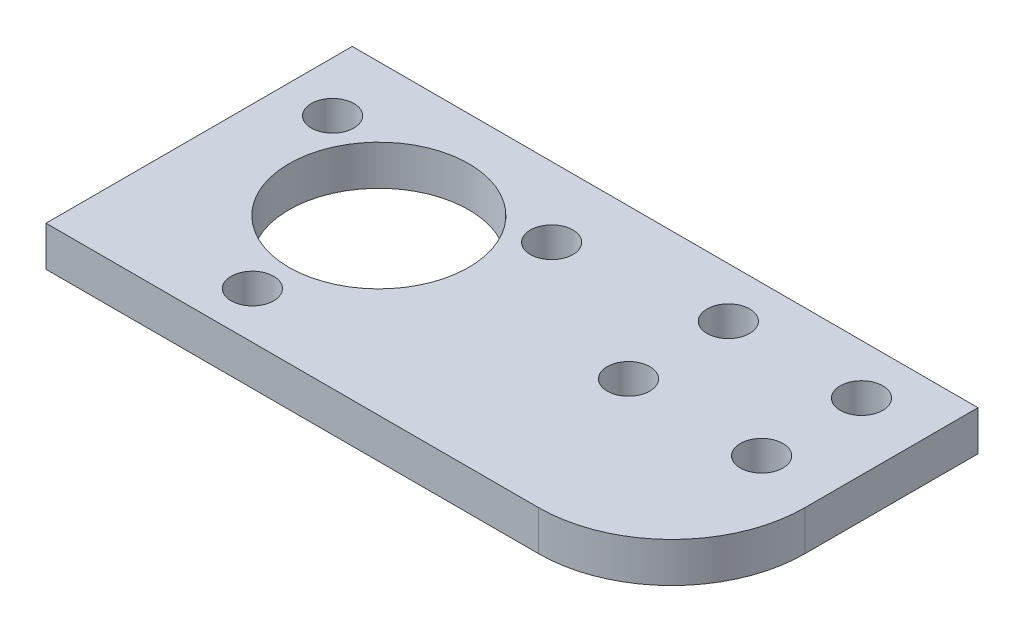
ISO-10303-21;
HEADER;
FILE_DESCRIPTION(('STEP AP214'),'2;1');
FILE_NAME('part.step','',(''),(''),'','','');
FILE_SCHEMA(('AUTOMOTIVE_DESIGN { 1 0 10303 214 1 1 1 1 }'));
ENDSEC;
DATA;
#1=APPLICATION_CONTEXT('core data for automotive mechanical design processes');
#2=APPLICATION_PROTOCOL_DEFINITION('international standard','automotive_design',2000,#1);
#3=PRODUCT_CONTEXT('',#1,'mechanical');
#4=PRODUCT('Part','Part','',(#3));
#5=PRODUCT_RELATED_PRODUCT_CATEGORY('part','',(#4));
#6=PRODUCT_DEFINITION_FORMATION('','',#4);
#7=PRODUCT_DEFINITION_CONTEXT('part definition',#1,'design');
#8=PRODUCT_DEFINITION('design','',#6,#7);
#9=PRODUCT_DEFINITION_SHAPE('','',#8);
#10=(LENGTH_UNIT() NAMED_UNIT(*) SI_UNIT(.MILLI.,.METRE.));
#11=(NAMED_UNIT(*) PLANE_ANGLE_UNIT() SI_UNIT($,.RADIAN.));
#12=(NAMED_UNIT(*) SI_UNIT($,.STERADIAN.) SOLID_ANGLE_UNIT());
#13=UNCERTAINTY_MEASURE_WITH_UNIT(LENGTH_MEASURE(1.E-05),#10,'distance_accuracy_value','');
#14=(GEOMETRIC_REPRESENTATION_CONTEXT(3) GLOBAL_UNCERTAINTY_ASSIGNED_CONTEXT((#13)) GLOBAL_UNIT_ASSIGNED_CONTEXT((#10,
#11,#12)) REPRESENTATION_CONTEXT('',''));
#15=CARTESIAN_POINT('',(0.,0.,0.));
#16=DIRECTION('',(0.,0.,1.));
#17=DIRECTION('',(1.,0.,0.));
#18=AXIS2_PLACEMENT_3D('',#15,#16,#17);
#19=CARTESIAN_POINT('',(27.5,3.,10.));
#20=DIRECTION('',(-1.,0.,0.));
#21=DIRECTION('',(0.,0.,1.));
#22=AXIS2_PLACEMENT_3D('',#19,#20,#21);
#23=PLANE('',#22);
#24=DIRECTION('',(0.,0.,-1.));
#25=VECTOR('',#24,1.);
#26=CARTESIAN_POINT('',(27.5,3.,10.));
#27=LINE('',#26,#25);
#28=CARTESIAN_POINT('',(27.5,3.,3.));
#29=VERTEX_POINT('',#28);
#30=CARTESIAN_POINT('',(27.5,3.,-10.));
#31=VERTEX_POINT('',#30);
#32=EDGE_CURVE('E126',#29,#31,#27,.T.);
#33=ORIENTED_EDGE('',*,*,#32,.F.);
#34=DIRECTION('',(0.,1.,0.));
#35=VECTOR('',#34,1.);
#36=CARTESIAN_POINT('',(27.5,0.,3.));
#37=LINE('',#36,#35);
#38=CARTESIAN_POINT('',(27.5,0.,3.));
#39=VERTEX_POINT('',#38);
#40=EDGE_CURVE('E63',#29,#39,#37,.F.);
#41=ORIENTED_EDGE('',*,*,#40,.T.);
#42=DIRECTION('',(0.,0.,-1.));
#43=VECTOR('',#42,1.);
#44=CARTESIAN_POINT('',(27.5,0.,10.));
#45=LINE('',#44,#43);
#46=CARTESIAN_POINT('',(27.5,0.,-10.));
#47=VERTEX_POINT('',#46);
#48=EDGE_CURVE('E127',#39,#47,#45,.T.);
#49=ORIENTED_EDGE('',*,*,#48,.T.);
#50=DIRECTION('',(0.,-1.,0.));
#51=VECTOR('',#50,1.);
#52=CARTESIAN_POINT('',(27.5,3.,-10.));
#53=LINE('',#52,#51);
#54=EDGE_CURVE('E125',#31,#47,#53,.T.);
#55=ORIENTED_EDGE('',*,*,#54,.F.);
#56=EDGE_LOOP('',(#33,#41,#49,#55));
#57=FACE_BOUND('',#56,.T.);
#58=ADVANCED_FACE('F55',(#57),#23,.F.);
#59=CARTESIAN_POINT('',(-27.5,3.,-10.));
#60=DIRECTION('',(0.,0.,1.));
#61=DIRECTION('',(1.,0.,0.));
#62=AXIS2_PLACEMENT_3D('',#59,#60,#61);
#63=PLANE('',#62);
#64=DIRECTION('',(-1.,0.,0.));
#65=VECTOR('',#64,1.);
#66=CARTESIAN_POINT('',(-27.5,0.,-10.));
#67=LINE('',#66,#65);
#68=CARTESIAN_POINT('',(-19.5,0.,-10.));
#69=VERTEX_POINT('',#68);
#70=EDGE_CURVE('E118',#47,#69,#67,.T.);
#71=ORIENTED_EDGE('',*,*,#70,.T.);
#72=DIRECTION('',(0.,1.,0.));
#73=VECTOR('',#72,1.);
#74=CARTESIAN_POINT('',(-19.5,0.,-10.));
#75=LINE('',#74,#73);
#76=CARTESIAN_POINT('',(-19.5,3.,-10.));
#77=VERTEX_POINT('',#76);
#78=EDGE_CURVE('E99',#69,#77,#75,.T.);
#79=ORIENTED_EDGE('',*,*,#78,.T.);
#80=DIRECTION('',(-1.,0.,0.));
#81=VECTOR('',#80,1.);
#82=CARTESIAN_POINT('',(-27.5,3.,-10.));
#83=LINE('',#82,#81);
#84=EDGE_CURVE('E129',#31,#77,#83,.T.);
#85=ORIENTED_EDGE('',*,*,#84,.F.);
#86=ORIENTED_EDGE('',*,*,#54,.T.);
#87=EDGE_LOOP('',(#71,#79,#85,#86));
#88=FACE_BOUND('',#87,.T.);
#89=ADVANCED_FACE('F123',(#88),#63,.F.);
#90=CARTESIAN_POINT('',(0.,3.,0.));
#91=DIRECTION('',(0.,-1.,0.));
#92=DIRECTION('',(0.,0.,-1.));
#93=AXIS2_PLACEMENT_3D('',#90,#91,#92);
#94=PLANE('',#93);
#95=CARTESIAN_POINT('',(-7.5,3.,9.5));
#96=DIRECTION('',(0.,1.,0.));
#97=DIRECTION('',(0.,0.,1.));
#98=AXIS2_PLACEMENT_3D('',#95,#96,#97);
#99=CIRCLE('',#98,1.6);
#100=CARTESIAN_POINT('',(-7.5,3.,11.1));
#101=VERTEX_POINT('',#100);
#102=EDGE_CURVE('E181',#101,#101,#99,.T.);
#103=ORIENTED_EDGE('',*,*,#102,.F.);
#104=EDGE_LOOP('',(#103));
#105=FACE_BOUND('',#104,.T.);
#106=CARTESIAN_POINT('',(12.5,3.,-6.25));
#107=DIRECTION('',(0.,1.,0.));
#108=DIRECTION('',(0.,0.,-1.));
#109=AXIS2_PLACEMENT_3D('',#106,#107,#108);
#110=CIRCLE('',#109,1.6);
#111=CARTESIAN_POINT('',(12.5,3.,-7.85));
#112=VERTEX_POINT('',#111);
#113=EDGE_CURVE('E157',#112,#112,#110,.T.);
#114=ORIENTED_EDGE('',*,*,#113,.F.);
#115=EDGE_LOOP('',(#114));
#116=FACE_BOUND('',#115,.T.);
#117=CARTESIAN_POINT('',(22.5,3.,1.25));
#118=DIRECTION('',(0.,1.,0.));
#119=DIRECTION('',(0.,0.,-1.));
#120=AXIS2_PLACEMENT_3D('',#117,#118,#119);
#121=CIRCLE('',#120,1.6);
#122=CARTESIAN_POINT('',(22.5,3.,-0.350000000000002));
#123=VERTEX_POINT('',#122);
#124=EDGE_CURVE('E164',#123,#123,#121,.T.);
#125=ORIENTED_EDGE('',*,*,#124,.F.);
#126=EDGE_LOOP('',(#125));
#127=FACE_BOUND('',#126,.T.);
#128=CARTESIAN_POINT('',(12.5,3.,1.25));
#129=DIRECTION('',(0.,1.,0.));
#130=DIRECTION('',(0.,0.,1.));
#131=AXIS2_PLACEMENT_3D('',#128,#129,#130);
#132=CIRCLE('',#131,1.6);
#133=CARTESIAN_POINT('',(12.5,3.,2.85));
#134=VERTEX_POINT('',#133);
#135=EDGE_CURVE('E151',#134,#134,#132,.T.);
#136=ORIENTED_EDGE('',*,*,#135,.F.);
#137=EDGE_LOOP('',(#136));
#138=FACE_BOUND('',#137,.T.);
#139=CARTESIAN_POINT('',(22.5,3.,-6.25));
#140=DIRECTION('',(0.,1.,0.));
#141=DIRECTION('',(0.,0.,1.));
#142=AXIS2_PLACEMENT_3D('',#139,#140,#141);
#143=CIRCLE('',#142,1.6);
#144=CARTESIAN_POINT('',(22.5,3.,-4.65));
#145=VERTEX_POINT('',#144);
#146=EDGE_CURVE('E160',#145,#145,#143,.T.);
#147=ORIENTED_EDGE('',*,*,#146,.F.);
#148=EDGE_LOOP('',(#147));
#149=FACE_BOUND('',#148,.T.);
#150=CARTESIAN_POINT('',(0.727241335952148,3.,-4.75000000000004));
#151=DIRECTION('',(0.,1.,0.));
#152=DIRECTION('',(0.,0.,1.));
#153=AXIS2_PLACEMENT_3D('',#150,#151,#152);
#154=CIRCLE('',#153,1.6);
#155=CARTESIAN_POINT('',(0.727241335952148,3.,-3.15000000000004));
#156=VERTEX_POINT('',#155);
#157=EDGE_CURVE('E188',#156,#156,#154,.T.);
#158=ORIENTED_EDGE('',*,*,#157,.F.);
#159=EDGE_LOOP('',(#158));
#160=FACE_BOUND('',#159,.T.);
#161=CARTESIAN_POINT('',(-7.5,3.,0.));
#162=DIRECTION('',(0.,1.,0.));
#163=DIRECTION('',(0.,0.,1.));
#164=AXIS2_PLACEMENT_3D('',#161,#162,#163);
#165=CIRCLE('',#164,6.75);
#166=CARTESIAN_POINT('',(-7.5,3.,6.75));
#167=VERTEX_POINT('',#166);
#168=EDGE_CURVE('E175',#167,#167,#165,.T.);
#169=ORIENTED_EDGE('',*,*,#168,.F.);
#170=EDGE_LOOP('',(#169));
#171=FACE_BOUND('',#170,.T.);
#172=CARTESIAN_POINT('',(-15.7272413359521,3.,-4.75000000000003));
#173=DIRECTION('',(0.,1.,0.));
#174=DIRECTION('',(0.,0.,1.));
#175=AXIS2_PLACEMENT_3D('',#172,#173,#174);
#176=CIRCLE('',#175,1.60000000000001);
#177=CARTESIAN_POINT('',(-15.7272413359521,3.,-3.15000000000002));
#178=VERTEX_POINT('',#177);
#179=EDGE_CURVE('E184',#178,#178,#176,.T.);
#180=ORIENTED_EDGE('',*,*,#179,.F.);
#181=EDGE_LOOP('',(#180));
#182=FACE_BOUND('',#181,.T.);
#183=DIRECTION('',(1.,0.,0.));
#184=VECTOR('',#183,1.);
#185=CARTESIAN_POINT('',(27.5,3.,13.));
#186=LINE('',#185,#184);
#187=CARTESIAN_POINT('',(-19.5,3.,13.));
#188=VERTEX_POINT('',#187);
#189=CARTESIAN_POINT('',(17.5,3.,13.));
#190=VERTEX_POINT('',#189);
#191=EDGE_CURVE('E110',#188,#190,#186,.T.);
#192=ORIENTED_EDGE('',*,*,#191,.T.);
#193=CARTESIAN_POINT('',(17.5,3.,3.));
#194=DIRECTION('',(0.,-1.,0.));
#195=DIRECTION('',(0.,0.,-1.));
#196=AXIS2_PLACEMENT_3D('',#193,#194,#195);
#197=CIRCLE('',#196,10.);
#198=EDGE_CURVE('E77',#190,#29,#197,.F.);
#199=ORIENTED_EDGE('',*,*,#198,.T.);
#200=ORIENTED_EDGE('',*,*,#32,.T.);
#201=ORIENTED_EDGE('',*,*,#84,.T.);
#202=DIRECTION('',(0.,0.,-1.));
#203=VECTOR('',#202,1.);
#204=CARTESIAN_POINT('',(-19.5,3.,-10.));
#205=LINE('',#204,#203);
#206=EDGE_CURVE('E105',#188,#77,#205,.T.);
#207=ORIENTED_EDGE('',*,*,#206,.F.);
#208=EDGE_LOOP('',(#192,#199,#200,#201,#207));
#209=FACE_BOUND('',#208,.T.);
#210=ADVANCED_FACE('F145',(#105,#116,#127,#138,#149,#160,#171,#182,#209),#94,.F.);
#211=CARTESIAN_POINT('',(0.,0.,0.));
#212=DIRECTION('',(0.,-1.,0.));
#213=DIRECTION('',(0.,0.,-1.));
#214=AXIS2_PLACEMENT_3D('',#211,#212,#213);
#215=PLANE('',#214);
#216=ORIENTED_EDGE('',*,*,#48,.F.);
#217=CARTESIAN_POINT('',(17.5,0.,3.));
#218=DIRECTION('',(0.,-1.,0.));
#219=DIRECTION('',(0.,0.,-1.));
#220=AXIS2_PLACEMENT_3D('',#217,#218,#219);
#221=CIRCLE('',#220,10.);
#222=CARTESIAN_POINT('',(17.5,0.,13.));
#223=VERTEX_POINT('',#222);
#224=EDGE_CURVE('E12',#39,#223,#221,.T.);
#225=ORIENTED_EDGE('',*,*,#224,.T.);
#226=DIRECTION('',(1.,0.,0.));
#227=VECTOR('',#226,1.);
#228=CARTESIAN_POINT('',(-27.5,0.,13.));
#229=LINE('',#228,#227);
#230=CARTESIAN_POINT('',(-19.5,0.,13.));
#231=VERTEX_POINT('',#230);
#232=EDGE_CURVE('E121',#231,#223,#229,.T.);
#233=ORIENTED_EDGE('',*,*,#232,.F.);
#234=DIRECTION('',(0.,0.,-1.));
#235=VECTOR('',#234,1.);
#236=CARTESIAN_POINT('',(-19.5,0.,-10.));
#237=LINE('',#236,#235);
#238=EDGE_CURVE('E102',#231,#69,#237,.T.);
#239=ORIENTED_EDGE('',*,*,#238,.T.);
#240=ORIENTED_EDGE('',*,*,#70,.F.);
#241=EDGE_LOOP('',(#216,#225,#233,#239,#240));
#242=FACE_BOUND('',#241,.T.);
#243=CARTESIAN_POINT('',(-7.5,0.,9.5));
#244=DIRECTION('',(0.,1.,0.));
#245=DIRECTION('',(0.,0.,1.));
#246=AXIS2_PLACEMENT_3D('',#243,#244,#245);
#247=CIRCLE('',#246,1.6);
#248=CARTESIAN_POINT('',(-7.5,0.,11.1));
#249=VERTEX_POINT('',#248);
#250=EDGE_CURVE('E185',#249,#249,#247,.T.);
#251=ORIENTED_EDGE('',*,*,#250,.T.);
#252=EDGE_LOOP('',(#251));
#253=FACE_BOUND('',#252,.T.);
#254=CARTESIAN_POINT('',(12.5,0.,-6.25));
#255=DIRECTION('',(0.,1.,0.));
#256=DIRECTION('',(0.,0.,-1.));
#257=AXIS2_PLACEMENT_3D('',#254,#255,#256);
#258=CIRCLE('',#257,1.6);
#259=CARTESIAN_POINT('',(12.5,0.,-7.85));
#260=VERTEX_POINT('',#259);
#261=EDGE_CURVE('E161',#260,#260,#258,.T.);
#262=ORIENTED_EDGE('',*,*,#261,.T.);
#263=EDGE_LOOP('',(#262));
#264=FACE_BOUND('',#263,.T.);
#265=CARTESIAN_POINT('',(22.5,0.,1.25));
#266=DIRECTION('',(0.,1.,0.));
#267=DIRECTION('',(0.,0.,-1.));
#268=AXIS2_PLACEMENT_3D('',#265,#266,#267);
#269=CIRCLE('',#268,1.6);
#270=CARTESIAN_POINT('',(22.5,0.,-0.350000000000002));
#271=VERTEX_POINT('',#270);
#272=EDGE_CURVE('E154',#271,#271,#269,.T.);
#273=ORIENTED_EDGE('',*,*,#272,.T.);
#274=EDGE_LOOP('',(#273));
#275=FACE_BOUND('',#274,.T.);
#276=CARTESIAN_POINT('',(12.5,0.,1.25));
#277=DIRECTION('',(0.,1.,0.));
#278=DIRECTION('',(0.,0.,1.));
#279=AXIS2_PLACEMENT_3D('',#276,#277,#278);
#280=CIRCLE('',#279,1.6);
#281=CARTESIAN_POINT('',(12.5,0.,2.85));
#282=VERTEX_POINT('',#281);
#283=EDGE_CURVE('E147',#282,#282,#280,.T.);
#284=ORIENTED_EDGE('',*,*,#283,.T.);
#285=EDGE_LOOP('',(#284));
#286=FACE_BOUND('',#285,.T.);
#287=CARTESIAN_POINT('',(22.5,0.,-6.25));
#288=DIRECTION('',(0.,1.,0.));
#289=DIRECTION('',(0.,0.,1.));
#290=AXIS2_PLACEMENT_3D('',#287,#288,#289);
#291=CIRCLE('',#290,1.6);
#292=CARTESIAN_POINT('',(22.5,0.,-4.65));
#293=VERTEX_POINT('',#292);
#294=EDGE_CURVE('E169',#293,#293,#291,.T.);
#295=ORIENTED_EDGE('',*,*,#294,.T.);
#296=EDGE_LOOP('',(#295));
#297=FACE_BOUND('',#296,.T.);
#298=CARTESIAN_POINT('',(0.727241335952148,0.,-4.75000000000004));
#299=DIRECTION('',(0.,1.,0.));
#300=DIRECTION('',(0.,0.,1.));
#301=AXIS2_PLACEMENT_3D('',#298,#299,#300);
#302=CIRCLE('',#301,1.6);
#303=CARTESIAN_POINT('',(0.727241335952148,0.,-3.15000000000004));
#304=VERTEX_POINT('',#303);
#305=EDGE_CURVE('E178',#304,#304,#302,.T.);
#306=ORIENTED_EDGE('',*,*,#305,.T.);
#307=EDGE_LOOP('',(#306));
#308=FACE_BOUND('',#307,.T.);
#309=CARTESIAN_POINT('',(-7.5,0.,0.));
#310=DIRECTION('',(0.,1.,0.));
#311=DIRECTION('',(0.,0.,1.));
#312=AXIS2_PLACEMENT_3D('',#309,#310,#311);
#313=CIRCLE('',#312,6.75);
#314=CARTESIAN_POINT('',(-7.5,0.,6.75));
#315=VERTEX_POINT('',#314);
#316=EDGE_CURVE('E172',#315,#315,#313,.T.);
#317=ORIENTED_EDGE('',*,*,#316,.T.);
#318=EDGE_LOOP('',(#317));
#319=FACE_BOUND('',#318,.T.);
#320=CARTESIAN_POINT('',(-15.7272413359521,0.,-4.75000000000003));
#321=DIRECTION('',(0.,1.,0.));
#322=DIRECTION('',(0.,0.,1.));
#323=AXIS2_PLACEMENT_3D('',#320,#321,#322);
#324=CIRCLE('',#323,1.60000000000001);
#325=CARTESIAN_POINT('',(-15.7272413359521,0.,-3.15000000000002));
#326=VERTEX_POINT('',#325);
#327=EDGE_CURVE('E131',#326,#326,#324,.T.);
#328=ORIENTED_EDGE('',*,*,#327,.T.);
#329=EDGE_LOOP('',(#328));
#330=FACE_BOUND('',#329,.T.);
#331=ADVANCED_FACE('F116',(#242,#253,#264,#275,#286,#297,#308,#319,#330),#215,.T.);
#332=CARTESIAN_POINT('',(-15.7272413359521,0.,-4.75000000000003));
#333=DIRECTION('',(0.,1.,0.));
#334=DIRECTION('',(0.,0.,1.));
#335=AXIS2_PLACEMENT_3D('',#332,#333,#334);
#336=CYLINDRICAL_SURFACE('',#335,1.60000000000001);
#337=ORIENTED_EDGE('',*,*,#327,.F.);
#338=EDGE_LOOP('',(#337));
#339=FACE_BOUND('',#338,.T.);
#340=ORIENTED_EDGE('',*,*,#179,.T.);
#341=EDGE_LOOP('',(#340));
#342=FACE_BOUND('',#341,.T.);
#343=ADVANCED_FACE('F211',(#339,#342),#336,.F.);
#344=CARTESIAN_POINT('',(-7.5,0.,0.));
#345=DIRECTION('',(0.,1.,0.));
#346=DIRECTION('',(0.,0.,1.));
#347=AXIS2_PLACEMENT_3D('',#344,#345,#346);
#348=CYLINDRICAL_SURFACE('',#347,6.75);
#349=ORIENTED_EDGE('',*,*,#316,.F.);
#350=EDGE_LOOP('',(#349));
#351=FACE_BOUND('',#350,.T.);
#352=ORIENTED_EDGE('',*,*,#168,.T.);
#353=EDGE_LOOP('',(#352));
#354=FACE_BOUND('',#353,.T.);
#355=ADVANCED_FACE('F216',(#351,#354),#348,.F.);
#356=CARTESIAN_POINT('',(0.727241335952148,0.,-4.75000000000004));
#357=DIRECTION('',(0.,1.,0.));
#358=DIRECTION('',(0.,0.,1.));
#359=AXIS2_PLACEMENT_3D('',#356,#357,#358);
#360=CYLINDRICAL_SURFACE('',#359,1.6);
#361=ORIENTED_EDGE('',*,*,#305,.F.);
#362=EDGE_LOOP('',(#361));
#363=FACE_BOUND('',#362,.T.);
#364=ORIENTED_EDGE('',*,*,#157,.T.);
#365=EDGE_LOOP('',(#364));
#366=FACE_BOUND('',#365,.T.);
#367=ADVANCED_FACE('F218',(#363,#366),#360,.F.);
#368=CARTESIAN_POINT('',(-7.5,0.,9.5));
#369=DIRECTION('',(0.,1.,0.));
#370=DIRECTION('',(0.,0.,1.));
#371=AXIS2_PLACEMENT_3D('',#368,#369,#370);
#372=CYLINDRICAL_SURFACE('',#371,1.6);
#373=ORIENTED_EDGE('',*,*,#102,.T.);
#374=EDGE_LOOP('',(#373));
#375=FACE_BOUND('',#374,.T.);
#376=ORIENTED_EDGE('',*,*,#250,.F.);
#377=EDGE_LOOP('',(#376));
#378=FACE_BOUND('',#377,.T.);
#379=ADVANCED_FACE('F221',(#375,#378),#372,.F.);
#380=CARTESIAN_POINT('',(22.5,0.,-6.25));
#381=DIRECTION('',(0.,1.,0.));
#382=DIRECTION('',(0.,0.,1.));
#383=AXIS2_PLACEMENT_3D('',#380,#381,#382);
#384=CYLINDRICAL_SURFACE('',#383,1.6);
#385=ORIENTED_EDGE('',*,*,#294,.F.);
#386=EDGE_LOOP('',(#385));
#387=FACE_BOUND('',#386,.T.);
#388=ORIENTED_EDGE('',*,*,#146,.T.);
#389=EDGE_LOOP('',(#388));
#390=FACE_BOUND('',#389,.T.);
#391=ADVANCED_FACE('F225',(#387,#390),#384,.F.);
#392=CARTESIAN_POINT('',(12.5,0.,1.25));
#393=DIRECTION('',(0.,1.,0.));
#394=DIRECTION('',(0.,0.,1.));
#395=AXIS2_PLACEMENT_3D('',#392,#393,#394);
#396=CYLINDRICAL_SURFACE('',#395,1.6);
#397=ORIENTED_EDGE('',*,*,#283,.F.);
#398=EDGE_LOOP('',(#397));
#399=FACE_BOUND('',#398,.T.);
#400=ORIENTED_EDGE('',*,*,#135,.T.);
#401=EDGE_LOOP('',(#400));
#402=FACE_BOUND('',#401,.T.);
#403=ADVANCED_FACE('F232',(#399,#402),#396,.F.);
#404=CARTESIAN_POINT('',(22.5,0.,1.25));
#405=DIRECTION('',(0.,1.,0.));
#406=DIRECTION('',(0.,0.,1.));
#407=AXIS2_PLACEMENT_3D('',#404,#405,#406);
#408=CYLINDRICAL_SURFACE('',#407,1.6);
#409=ORIENTED_EDGE('',*,*,#272,.F.);
#410=EDGE_LOOP('',(#409));
#411=FACE_BOUND('',#410,.T.);
#412=ORIENTED_EDGE('',*,*,#124,.T.);
#413=EDGE_LOOP('',(#412));
#414=FACE_BOUND('',#413,.T.);
#415=ADVANCED_FACE('F234',(#411,#414),#408,.F.);
#416=CARTESIAN_POINT('',(12.5,0.,-6.25));
#417=DIRECTION('',(0.,1.,0.));
#418=DIRECTION('',(0.,0.,1.));
#419=AXIS2_PLACEMENT_3D('',#416,#417,#418);
#420=CYLINDRICAL_SURFACE('',#419,1.6);
#421=ORIENTED_EDGE('',*,*,#261,.F.);
#422=EDGE_LOOP('',(#421));
#423=FACE_BOUND('',#422,.T.);
#424=ORIENTED_EDGE('',*,*,#113,.T.);
#425=EDGE_LOOP('',(#424));
#426=FACE_BOUND('',#425,.T.);
#427=ADVANCED_FACE('F237',(#423,#426),#420,.F.);
#428=CARTESIAN_POINT('',(27.5,0.,13.));
#429=DIRECTION('',(0.,0.,1.));
#430=DIRECTION('',(1.,0.,0.));
#431=AXIS2_PLACEMENT_3D('',#428,#429,#430);
#432=PLANE('',#431);
#433=ORIENTED_EDGE('',*,*,#232,.T.);
#434=DIRECTION('',(0.,1.,0.));
#435=VECTOR('',#434,1.);
#436=CARTESIAN_POINT('',(17.5,3.,13.));
#437=LINE('',#436,#435);
#438=EDGE_CURVE('E136',#223,#190,#437,.T.);
#439=ORIENTED_EDGE('',*,*,#438,.T.);
#440=ORIENTED_EDGE('',*,*,#191,.F.);
#441=DIRECTION('',(0.,1.,0.));
#442=VECTOR('',#441,1.);
#443=CARTESIAN_POINT('',(-19.5,0.,13.));
#444=LINE('',#443,#442);
#445=EDGE_CURVE('E111',#231,#188,#444,.T.);
#446=ORIENTED_EDGE('',*,*,#445,.F.);
#447=EDGE_LOOP('',(#433,#439,#440,#446));
#448=FACE_BOUND('',#447,.T.);
#449=ADVANCED_FACE('F142',(#448),#432,.T.);
#450=CARTESIAN_POINT('',(-19.5,0.,-10.));
#451=DIRECTION('',(1.,0.,0.));
#452=DIRECTION('',(0.,0.,-1.));
#453=AXIS2_PLACEMENT_3D('',#450,#451,#452);
#454=PLANE('',#453);
#455=ORIENTED_EDGE('',*,*,#206,.T.);
#456=ORIENTED_EDGE('',*,*,#78,.F.);
#457=ORIENTED_EDGE('',*,*,#238,.F.);
#458=ORIENTED_EDGE('',*,*,#445,.T.);
#459=EDGE_LOOP('',(#455,#456,#457,#458));
#460=FACE_BOUND('',#459,.T.);
#461=ADVANCED_FACE('F101',(#460),#454,.F.);
#462=CARTESIAN_POINT('',(17.5,0.,3.));
#463=DIRECTION('',(0.,-1.,0.));
#464=DIRECTION('',(0.,0.,-1.));
#465=AXIS2_PLACEMENT_3D('',#462,#463,#464);
#466=CYLINDRICAL_SURFACE('',#465,10.);
#467=ORIENTED_EDGE('',*,*,#224,.F.);
#468=ORIENTED_EDGE('',*,*,#40,.F.);
#469=ORIENTED_EDGE('',*,*,#198,.F.);
#470=ORIENTED_EDGE('',*,*,#438,.F.);
#471=EDGE_LOOP('',(#467,#468,#469,#470));
#472=FACE_BOUND('',#471,.T.);
#473=ADVANCED_FACE('F57',(#472),#466,.T.);
#474=CLOSED_SHELL('',(#58,#89,#210,#331,#343,#355,#367,#379,#391,#403,#415,#427,#449,#461,#473));
#475=MANIFOLD_SOLID_BREP('B2',#474);
#476=ADVANCED_BREP_SHAPE_REPRESENTATION('',(#18,#475),#14);
#477=SHAPE_DEFINITION_REPRESENTATION(#9,#476);
ENDSEC;
END-ISO-10303-21;
